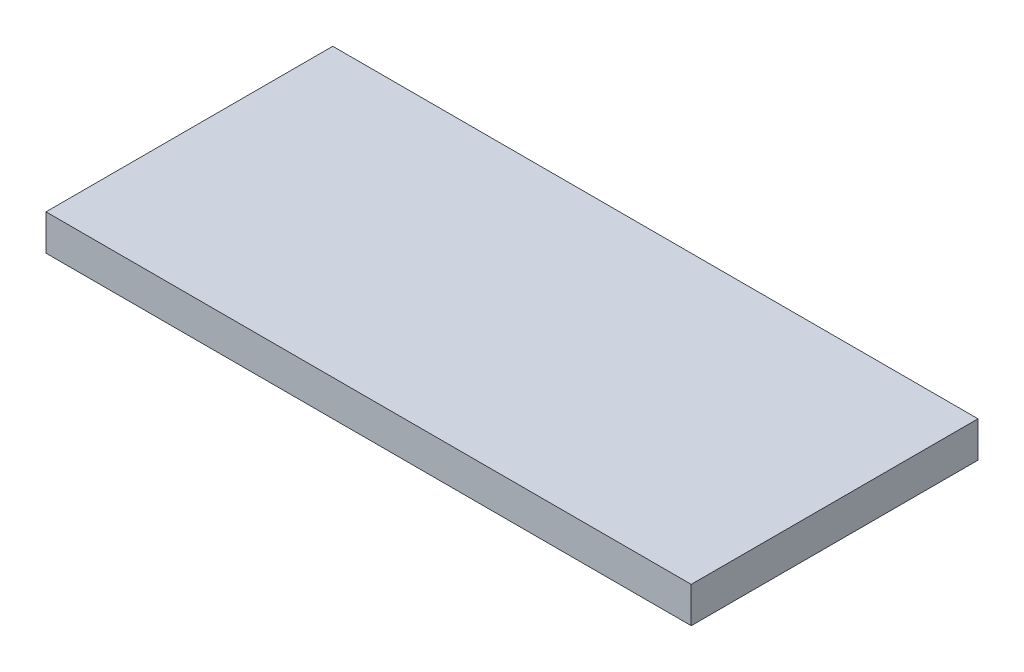
ISO-10303-21;
HEADER;
FILE_DESCRIPTION(('STEP AP214'),'2;1');
FILE_NAME('part.step','',(''),(''),'','','');
FILE_SCHEMA(('AUTOMOTIVE_DESIGN { 1 0 10303 214 1 1 1 1 }'));
ENDSEC;
DATA;
#1=APPLICATION_CONTEXT('core data for automotive mechanical design processes');
#2=APPLICATION_PROTOCOL_DEFINITION('international standard','automotive_design',2000,#1);
#3=PRODUCT_CONTEXT('',#1,'mechanical');
#4=PRODUCT('Part','Part','',(#3));
#5=PRODUCT_RELATED_PRODUCT_CATEGORY('part','',(#4));
#6=PRODUCT_DEFINITION_FORMATION('','',#4);
#7=PRODUCT_DEFINITION_CONTEXT('part definition',#1,'design');
#8=PRODUCT_DEFINITION('design','',#6,#7);
#9=PRODUCT_DEFINITION_SHAPE('','',#8);
#10=(LENGTH_UNIT() NAMED_UNIT(*) SI_UNIT(.MILLI.,.METRE.));
#11=(NAMED_UNIT(*) PLANE_ANGLE_UNIT() SI_UNIT($,.RADIAN.));
#12=(NAMED_UNIT(*) SI_UNIT($,.STERADIAN.) SOLID_ANGLE_UNIT());
#13=UNCERTAINTY_MEASURE_WITH_UNIT(LENGTH_MEASURE(1.E-05),#10,'distance_accuracy_value','');
#14=(GEOMETRIC_REPRESENTATION_CONTEXT(3) GLOBAL_UNCERTAINTY_ASSIGNED_CONTEXT((#13)) GLOBAL_UNIT_ASSIGNED_CONTEXT((#10,
#11,#12)) REPRESENTATION_CONTEXT('',''));
#15=CARTESIAN_POINT('',(0.,0.,0.));
#16=DIRECTION('',(0.,0.,1.));
#17=DIRECTION('',(1.,0.,0.));
#18=AXIS2_PLACEMENT_3D('',#15,#16,#17);
#19=CARTESIAN_POINT('',(0.,2.54,0.));
#20=DIRECTION('',(1.,0.,0.));
#21=DIRECTION('',(0.,0.,-1.));
#22=AXIS2_PLACEMENT_3D('',#19,#20,#21);
#23=PLANE('',#22);
#24=DIRECTION('',(0.,0.,1.));
#25=VECTOR('',#24,1.);
#26=CARTESIAN_POINT('',(0.,0.,0.));
#27=LINE('',#26,#25);
#28=CARTESIAN_POINT('',(0.,0.,0.));
#29=VERTEX_POINT('',#28);
#30=CARTESIAN_POINT('',(0.,0.,20.32));
#31=VERTEX_POINT('',#30);
#32=EDGE_CURVE('E97',#29,#31,#27,.T.);
#33=ORIENTED_EDGE('',*,*,#32,.T.);
#34=DIRECTION('',(0.,-1.,0.));
#35=VECTOR('',#34,1.);
#36=CARTESIAN_POINT('',(0.,2.54,20.32));
#37=LINE('',#36,#35);
#38=CARTESIAN_POINT('',(0.,2.54,20.32));
#39=VERTEX_POINT('',#38);
#40=EDGE_CURVE('E11',#39,#31,#37,.T.);
#41=ORIENTED_EDGE('',*,*,#40,.F.);
#42=DIRECTION('',(0.,0.,1.));
#43=VECTOR('',#42,1.);
#44=CARTESIAN_POINT('',(0.,2.54,0.));
#45=LINE('',#44,#43);
#46=CARTESIAN_POINT('',(0.,2.54,0.));
#47=VERTEX_POINT('',#46);
#48=EDGE_CURVE('E85',#47,#39,#45,.T.);
#49=ORIENTED_EDGE('',*,*,#48,.F.);
#50=DIRECTION('',(0.,-1.,0.));
#51=VECTOR('',#50,1.);
#52=CARTESIAN_POINT('',(0.,2.54,0.));
#53=LINE('',#52,#51);
#54=EDGE_CURVE('E93',#47,#29,#53,.T.);
#55=ORIENTED_EDGE('',*,*,#54,.T.);
#56=EDGE_LOOP('',(#33,#41,#49,#55));
#57=FACE_BOUND('',#56,.T.);
#58=ADVANCED_FACE('F34',(#57),#23,.F.);
#59=CARTESIAN_POINT('',(0.,2.54,20.32));
#60=DIRECTION('',(0.,0.,-1.));
#61=DIRECTION('',(-1.,0.,0.));
#62=AXIS2_PLACEMENT_3D('',#59,#60,#61);
#63=PLANE('',#62);
#64=DIRECTION('',(1.,0.,0.));
#65=VECTOR('',#64,1.);
#66=CARTESIAN_POINT('',(0.,0.,20.32));
#67=LINE('',#66,#65);
#68=CARTESIAN_POINT('',(45.72,0.,20.32));
#69=VERTEX_POINT('',#68);
#70=EDGE_CURVE('E89',#31,#69,#67,.T.);
#71=ORIENTED_EDGE('',*,*,#70,.T.);
#72=DIRECTION('',(0.,-1.,0.));
#73=VECTOR('',#72,1.);
#74=CARTESIAN_POINT('',(45.72,2.54,20.32));
#75=LINE('',#74,#73);
#76=CARTESIAN_POINT('',(45.72,2.54,20.32));
#77=VERTEX_POINT('',#76);
#78=EDGE_CURVE('E42',#77,#69,#75,.T.);
#79=ORIENTED_EDGE('',*,*,#78,.F.);
#80=DIRECTION('',(1.,0.,0.));
#81=VECTOR('',#80,1.);
#82=CARTESIAN_POINT('',(0.,2.54,20.32));
#83=LINE('',#82,#81);
#84=EDGE_CURVE('E80',#39,#77,#83,.T.);
#85=ORIENTED_EDGE('',*,*,#84,.F.);
#86=ORIENTED_EDGE('',*,*,#40,.T.);
#87=EDGE_LOOP('',(#71,#79,#85,#86));
#88=FACE_BOUND('',#87,.T.);
#89=ADVANCED_FACE('F88',(#88),#63,.F.);
#90=CARTESIAN_POINT('',(45.72,2.54,0.));
#91=DIRECTION('',(-1.,0.,0.));
#92=DIRECTION('',(0.,0.,1.));
#93=AXIS2_PLACEMENT_3D('',#90,#91,#92);
#94=PLANE('',#93);
#95=DIRECTION('',(0.,0.,-1.));
#96=VECTOR('',#95,1.);
#97=CARTESIAN_POINT('',(45.72,0.,0.));
#98=LINE('',#97,#96);
#99=CARTESIAN_POINT('',(45.72,0.,0.));
#100=VERTEX_POINT('',#99);
#101=EDGE_CURVE('E67',#69,#100,#98,.T.);
#102=ORIENTED_EDGE('',*,*,#101,.T.);
#103=DIRECTION('',(0.,-1.,0.));
#104=VECTOR('',#103,1.);
#105=CARTESIAN_POINT('',(45.72,2.54,0.));
#106=LINE('',#105,#104);
#107=CARTESIAN_POINT('',(45.72,2.54,0.));
#108=VERTEX_POINT('',#107);
#109=EDGE_CURVE('E90',#108,#100,#106,.T.);
#110=ORIENTED_EDGE('',*,*,#109,.F.);
#111=DIRECTION('',(0.,0.,-1.));
#112=VECTOR('',#111,1.);
#113=CARTESIAN_POINT('',(45.72,2.54,0.));
#114=LINE('',#113,#112);
#115=EDGE_CURVE('E83',#77,#108,#114,.T.);
#116=ORIENTED_EDGE('',*,*,#115,.F.);
#117=ORIENTED_EDGE('',*,*,#78,.T.);
#118=EDGE_LOOP('',(#102,#110,#116,#117));
#119=FACE_BOUND('',#118,.T.);
#120=ADVANCED_FACE('F91',(#119),#94,.F.);
#121=CARTESIAN_POINT('',(0.,2.54,0.));
#122=DIRECTION('',(0.,0.,1.));
#123=DIRECTION('',(1.,0.,0.));
#124=AXIS2_PLACEMENT_3D('',#121,#122,#123);
#125=PLANE('',#124);
#126=DIRECTION('',(-1.,0.,0.));
#127=VECTOR('',#126,1.);
#128=CARTESIAN_POINT('',(0.,0.,0.));
#129=LINE('',#128,#127);
#130=EDGE_CURVE('E73',#100,#29,#129,.T.);
#131=ORIENTED_EDGE('',*,*,#130,.T.);
#132=ORIENTED_EDGE('',*,*,#54,.F.);
#133=DIRECTION('',(-1.,0.,0.));
#134=VECTOR('',#133,1.);
#135=CARTESIAN_POINT('',(0.,2.54,0.));
#136=LINE('',#135,#134);
#137=EDGE_CURVE('E50',#108,#47,#136,.T.);
#138=ORIENTED_EDGE('',*,*,#137,.F.);
#139=ORIENTED_EDGE('',*,*,#109,.T.);
#140=EDGE_LOOP('',(#131,#132,#138,#139));
#141=FACE_BOUND('',#140,.T.);
#142=ADVANCED_FACE('F104',(#141),#125,.F.);
#143=CARTESIAN_POINT('',(0.,2.54,0.));
#144=DIRECTION('',(0.,1.,0.));
#145=DIRECTION('',(0.,0.,1.));
#146=AXIS2_PLACEMENT_3D('',#143,#144,#145);
#147=PLANE('',#146);
#148=ORIENTED_EDGE('',*,*,#48,.T.);
#149=ORIENTED_EDGE('',*,*,#84,.T.);
#150=ORIENTED_EDGE('',*,*,#115,.T.);
#151=ORIENTED_EDGE('',*,*,#137,.T.);
#152=EDGE_LOOP('',(#148,#149,#150,#151));
#153=FACE_BOUND('',#152,.T.);
#154=ADVANCED_FACE('F81',(#153),#147,.T.);
#155=CARTESIAN_POINT('',(0.,0.,0.));
#156=DIRECTION('',(0.,1.,0.));
#157=DIRECTION('',(0.,0.,1.));
#158=AXIS2_PLACEMENT_3D('',#155,#156,#157);
#159=PLANE('',#158);
#160=ORIENTED_EDGE('',*,*,#32,.F.);
#161=ORIENTED_EDGE('',*,*,#130,.F.);
#162=ORIENTED_EDGE('',*,*,#101,.F.);
#163=ORIENTED_EDGE('',*,*,#70,.F.);
#164=EDGE_LOOP('',(#160,#161,#162,#163));
#165=FACE_BOUND('',#164,.T.);
#166=ADVANCED_FACE('F107',(#165),#159,.F.);
#167=CLOSED_SHELL('',(#58,#89,#120,#142,#154,#166));
#168=MANIFOLD_SOLID_BREP('B2',#167);
#169=ADVANCED_BREP_SHAPE_REPRESENTATION('',(#18,#168),#14);
#170=SHAPE_DEFINITION_REPRESENTATION(#9,#169);
ENDSEC;
END-ISO-10303-21;
